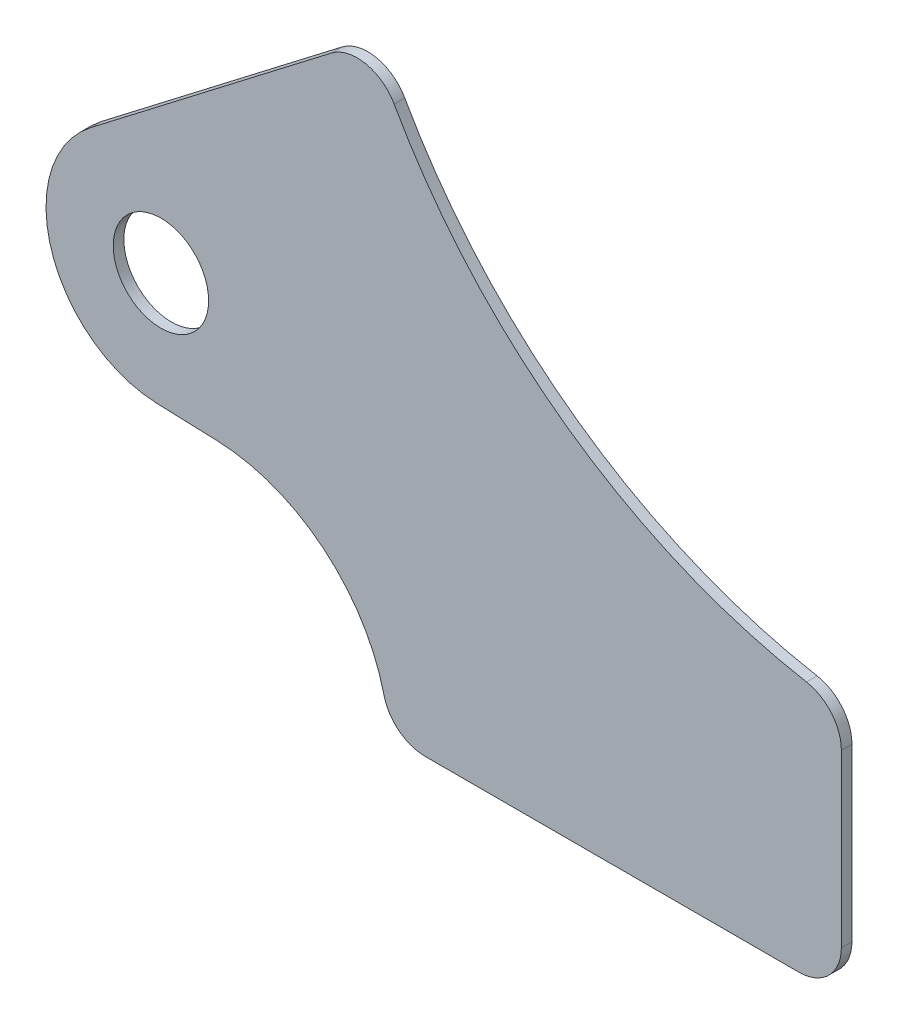
ISO-10303-21;
HEADER;
FILE_DESCRIPTION(('STEP AP214'),'2;1');
FILE_NAME('part.step','',(''),(''),'','','');
FILE_SCHEMA(('AUTOMOTIVE_DESIGN { 1 0 10303 214 1 1 1 1 }'));
ENDSEC;
DATA;
#1=APPLICATION_CONTEXT('core data for automotive mechanical design processes');
#2=APPLICATION_PROTOCOL_DEFINITION('international standard','automotive_design',2000,#1);
#3=PRODUCT_CONTEXT('',#1,'mechanical');
#4=PRODUCT('Part','Part','',(#3));
#5=PRODUCT_RELATED_PRODUCT_CATEGORY('part','',(#4));
#6=PRODUCT_DEFINITION_FORMATION('','',#4);
#7=PRODUCT_DEFINITION_CONTEXT('part definition',#1,'design');
#8=PRODUCT_DEFINITION('design','',#6,#7);
#9=PRODUCT_DEFINITION_SHAPE('','',#8);
#10=(LENGTH_UNIT() NAMED_UNIT(*) SI_UNIT(.MILLI.,.METRE.));
#11=(NAMED_UNIT(*) PLANE_ANGLE_UNIT() SI_UNIT($,.RADIAN.));
#12=(NAMED_UNIT(*) SI_UNIT($,.STERADIAN.) SOLID_ANGLE_UNIT());
#13=UNCERTAINTY_MEASURE_WITH_UNIT(LENGTH_MEASURE(1.E-05),#10,'distance_accuracy_value','');
#14=(GEOMETRIC_REPRESENTATION_CONTEXT(3) GLOBAL_UNCERTAINTY_ASSIGNED_CONTEXT((#13)) GLOBAL_UNIT_ASSIGNED_CONTEXT((#10,
#11,#12)) REPRESENTATION_CONTEXT('',''));
#15=CARTESIAN_POINT('',(0.,0.,0.));
#16=DIRECTION('',(0.,0.,1.));
#17=DIRECTION('',(1.,0.,0.));
#18=AXIS2_PLACEMENT_3D('',#15,#16,#17);
#19=CARTESIAN_POINT('',(69.0619678457086,-96.3981481371445,0.5));
#20=DIRECTION('',(0.,0.,-1.));
#21=DIRECTION('',(-1.,0.,0.));
#22=AXIS2_PLACEMENT_3D('',#19,#20,#21);
#23=PLANE('',#22);
#24=CARTESIAN_POINT('',(69.0619678457086,-96.3981481371445,0.5));
#25=DIRECTION('',(0.,0.,1.));
#26=DIRECTION('',(-1.,0.,0.));
#27=AXIS2_PLACEMENT_3D('',#24,#25,#26);
#28=CIRCLE('',#27,5.42071896114853);
#29=CARTESIAN_POINT('',(65.7594486030963,-92.0995948098109,0.5));
#30=VERTEX_POINT('',#29);
#31=CARTESIAN_POINT('',(68.866411541053,-101.815338533232,0.5));
#32=VERTEX_POINT('',#31);
#33=EDGE_CURVE('E159',#30,#32,#28,.T.);
#34=ORIENTED_EDGE('',*,*,#33,.T.);
#35=DIRECTION('',(0.99934905958303,-0.0360757135828762,0.));
#36=VECTOR('',#35,1.);
#37=CARTESIAN_POINT('',(68.866411541053,-101.815338533232,0.5));
#38=LINE('',#37,#36);
#39=CARTESIAN_POINT('',(71.7097317347927,-101.917980151744,0.5));
#40=VERTEX_POINT('',#39);
#41=EDGE_CURVE('E130',#32,#40,#38,.T.);
#42=ORIENTED_EDGE('',*,*,#41,.T.);
#43=CARTESIAN_POINT('',(71.4063879557372,-110.321038337497,0.5));
#44=DIRECTION('',(0.,0.,-1.));
#45=DIRECTION('',(1.,0.,0.));
#46=AXIS2_PLACEMENT_3D('',#43,#44,#45);
#47=CIRCLE('',#46,8.4085316388438);
#48=CARTESIAN_POINT('',(79.5867015670892,-108.375306202446,0.5));
#49=VERTEX_POINT('',#48);
#50=EDGE_CURVE('E162',#40,#49,#47,.T.);
#51=ORIENTED_EDGE('',*,*,#50,.T.);
#52=CARTESIAN_POINT('',(81.532419074665,-107.912506698651,0.5));
#53=DIRECTION('',(0.,0.,1.));
#54=DIRECTION('',(1.,0.,0.));
#55=AXIS2_PLACEMENT_3D('',#52,#53,#54);
#56=CIRCLE('',#55,2.);
#57=CARTESIAN_POINT('',(81.532419074665,-109.912506698651,0.5));
#58=VERTEX_POINT('',#57);
#59=EDGE_CURVE('E164',#49,#58,#56,.T.);
#60=ORIENTED_EDGE('',*,*,#59,.T.);
#61=DIRECTION('',(1.,0.,0.));
#62=VECTOR('',#61,1.);
#63=CARTESIAN_POINT('',(99.1688425464614,-109.912506698651,0.5));
#64=LINE('',#63,#62);
#65=CARTESIAN_POINT('',(99.1688425464614,-109.912506698651,0.5));
#66=VERTEX_POINT('',#65);
#67=EDGE_CURVE('E166',#58,#66,#64,.T.);
#68=ORIENTED_EDGE('',*,*,#67,.T.);
#69=CARTESIAN_POINT('',(99.1688425464614,-107.912506698651,0.5));
#70=DIRECTION('',(0.,0.,1.));
#71=DIRECTION('',(1.,0.,0.));
#72=AXIS2_PLACEMENT_3D('',#69,#70,#71);
#73=CIRCLE('',#72,2.);
#74=CARTESIAN_POINT('',(101.168842546461,-107.912506698651,0.5));
#75=VERTEX_POINT('',#74);
#76=EDGE_CURVE('E168',#66,#75,#73,.T.);
#77=ORIENTED_EDGE('',*,*,#76,.T.);
#78=DIRECTION('',(0.,1.,0.));
#79=VECTOR('',#78,1.);
#80=CARTESIAN_POINT('',(101.168842546461,-99.8422971697387,0.5));
#81=LINE('',#80,#79);
#82=CARTESIAN_POINT('',(101.168842546461,-99.8422971697387,0.5));
#83=VERTEX_POINT('',#82);
#84=EDGE_CURVE('E170',#75,#83,#81,.T.);
#85=ORIENTED_EDGE('',*,*,#84,.T.);
#86=CARTESIAN_POINT('',(99.1688425464614,-99.8422971697387,0.5));
#87=DIRECTION('',(0.,0.,1.));
#88=DIRECTION('',(1.,0.,0.));
#89=AXIS2_PLACEMENT_3D('',#86,#87,#88);
#90=CIRCLE('',#89,2.);
#91=CARTESIAN_POINT('',(99.5247156634242,-97.8742132475892,0.5));
#92=VERTEX_POINT('',#91);
#93=EDGE_CURVE('E172',#83,#92,#90,.T.);
#94=ORIENTED_EDGE('',*,*,#93,.T.);
#95=CARTESIAN_POINT('',(104.506939300903,-70.3210383374967,0.5));
#96=DIRECTION('',(0.,0.,-1.));
#97=DIRECTION('',(1.,0.,0.));
#98=AXIS2_PLACEMENT_3D('',#95,#96,#97);
#99=CIRCLE('',#98,28.);
#100=CARTESIAN_POINT('',(80.070719907068,-83.9911217950465,0.5));
#101=VERTEX_POINT('',#100);
#102=EDGE_CURVE('E174',#92,#101,#99,.T.);
#103=ORIENTED_EDGE('',*,*,#102,.T.);
#104=CARTESIAN_POINT('',(78.3252756646512,-84.9675563277287,0.5));
#105=DIRECTION('',(0.,0.,1.));
#106=DIRECTION('',(1.,0.,0.));
#107=AXIS2_PLACEMENT_3D('',#104,#105,#106);
#108=CIRCLE('',#107,1.99999999999999);
#109=CARTESIAN_POINT('',(77.1067955086859,-83.3815846667212,0.5));
#110=VERTEX_POINT('',#109);
#111=EDGE_CURVE('E53',#101,#110,#108,.T.);
#112=ORIENTED_EDGE('',*,*,#111,.T.);
#113=DIRECTION('',(-0.792985830503717,-0.609240077982671,0.));
#114=VECTOR('',#113,1.);
#115=CARTESIAN_POINT('',(65.7594486030963,-92.0995948098109,0.5));
#116=LINE('',#115,#114);
#117=EDGE_CURVE('E48',#110,#30,#116,.T.);
#118=ORIENTED_EDGE('',*,*,#117,.T.);
#119=EDGE_LOOP('',(#34,#42,#51,#60,#68,#77,#85,#94,#103,#112,#118));
#120=FACE_BOUND('',#119,.T.);
#121=CARTESIAN_POINT('',(69.0619678457086,-96.3981481371445,0.5));
#122=DIRECTION('',(0.,0.,1.));
#123=DIRECTION('',(1.,0.,0.));
#124=AXIS2_PLACEMENT_3D('',#121,#122,#123);
#125=CIRCLE('',#124,2.25);
#126=CARTESIAN_POINT('',(71.3119678457086,-96.3981481371445,0.5));
#127=VERTEX_POINT('',#126);
#128=EDGE_CURVE('E135',#127,#127,#125,.T.);
#129=ORIENTED_EDGE('',*,*,#128,.F.);
#130=EDGE_LOOP('',(#129));
#131=FACE_BOUND('',#130,.T.);
#132=ADVANCED_FACE('F33',(#120,#131),#23,.F.);
#133=CARTESIAN_POINT('',(69.0619678457086,-96.3981481371445,0.));
#134=DIRECTION('',(0.,0.,-1.));
#135=DIRECTION('',(-1.,0.,0.));
#136=AXIS2_PLACEMENT_3D('',#133,#134,#135);
#137=PLANE('',#136);
#138=CARTESIAN_POINT('',(69.0619678457086,-96.3981481371445,0.));
#139=DIRECTION('',(0.,0.,1.));
#140=DIRECTION('',(-1.,0.,0.));
#141=AXIS2_PLACEMENT_3D('',#138,#139,#140);
#142=CIRCLE('',#141,5.42071896114853);
#143=CARTESIAN_POINT('',(65.7594486030963,-92.0995948098109,0.));
#144=VERTEX_POINT('',#143);
#145=CARTESIAN_POINT('',(68.866411541053,-101.815338533232,0.));
#146=VERTEX_POINT('',#145);
#147=EDGE_CURVE('E121',#144,#146,#142,.T.);
#148=ORIENTED_EDGE('',*,*,#147,.F.);
#149=DIRECTION('',(-0.792985830503717,-0.609240077982671,0.));
#150=VECTOR('',#149,1.);
#151=CARTESIAN_POINT('',(65.7594486030963,-92.0995948098109,0.));
#152=LINE('',#151,#150);
#153=CARTESIAN_POINT('',(77.1067955086859,-83.3815846667212,0.));
#154=VERTEX_POINT('',#153);
#155=EDGE_CURVE('E157',#154,#144,#152,.T.);
#156=ORIENTED_EDGE('',*,*,#155,.F.);
#157=CARTESIAN_POINT('',(78.3252756646512,-84.9675563277287,0.));
#158=DIRECTION('',(0.,0.,1.));
#159=DIRECTION('',(1.,0.,0.));
#160=AXIS2_PLACEMENT_3D('',#157,#158,#159);
#161=CIRCLE('',#160,1.99999999999999);
#162=CARTESIAN_POINT('',(80.070719907068,-83.9911217950465,0.));
#163=VERTEX_POINT('',#162);
#164=EDGE_CURVE('E155',#163,#154,#161,.T.);
#165=ORIENTED_EDGE('',*,*,#164,.F.);
#166=CARTESIAN_POINT('',(104.506939300903,-70.3210383374967,0.));
#167=DIRECTION('',(0.,0.,-1.));
#168=DIRECTION('',(1.,0.,0.));
#169=AXIS2_PLACEMENT_3D('',#166,#167,#168);
#170=CIRCLE('',#169,28.);
#171=CARTESIAN_POINT('',(99.5247156634242,-97.8742132475892,0.));
#172=VERTEX_POINT('',#171);
#173=EDGE_CURVE('E153',#172,#163,#170,.T.);
#174=ORIENTED_EDGE('',*,*,#173,.F.);
#175=CARTESIAN_POINT('',(99.1688425464614,-99.8422971697387,0.));
#176=DIRECTION('',(0.,0.,1.));
#177=DIRECTION('',(1.,0.,0.));
#178=AXIS2_PLACEMENT_3D('',#175,#176,#177);
#179=CIRCLE('',#178,2.);
#180=CARTESIAN_POINT('',(101.168842546461,-99.8422971697387,0.));
#181=VERTEX_POINT('',#180);
#182=EDGE_CURVE('E151',#181,#172,#179,.T.);
#183=ORIENTED_EDGE('',*,*,#182,.F.);
#184=DIRECTION('',(0.,1.,0.));
#185=VECTOR('',#184,1.);
#186=CARTESIAN_POINT('',(101.168842546461,-99.8422971697387,0.));
#187=LINE('',#186,#185);
#188=CARTESIAN_POINT('',(101.168842546461,-107.912506698651,0.));
#189=VERTEX_POINT('',#188);
#190=EDGE_CURVE('E149',#189,#181,#187,.T.);
#191=ORIENTED_EDGE('',*,*,#190,.F.);
#192=CARTESIAN_POINT('',(99.1688425464614,-107.912506698651,0.));
#193=DIRECTION('',(0.,0.,1.));
#194=DIRECTION('',(1.,0.,0.));
#195=AXIS2_PLACEMENT_3D('',#192,#193,#194);
#196=CIRCLE('',#195,2.);
#197=CARTESIAN_POINT('',(99.1688425464614,-109.912506698651,0.));
#198=VERTEX_POINT('',#197);
#199=EDGE_CURVE('E147',#198,#189,#196,.T.);
#200=ORIENTED_EDGE('',*,*,#199,.F.);
#201=DIRECTION('',(1.,0.,0.));
#202=VECTOR('',#201,1.);
#203=CARTESIAN_POINT('',(99.1688425464614,-109.912506698651,0.));
#204=LINE('',#203,#202);
#205=CARTESIAN_POINT('',(81.532419074665,-109.912506698651,0.));
#206=VERTEX_POINT('',#205);
#207=EDGE_CURVE('E145',#206,#198,#204,.T.);
#208=ORIENTED_EDGE('',*,*,#207,.F.);
#209=CARTESIAN_POINT('',(81.532419074665,-107.912506698651,0.));
#210=DIRECTION('',(0.,0.,1.));
#211=DIRECTION('',(1.,0.,0.));
#212=AXIS2_PLACEMENT_3D('',#209,#210,#211);
#213=CIRCLE('',#212,2.);
#214=CARTESIAN_POINT('',(79.5867015670892,-108.375306202446,0.));
#215=VERTEX_POINT('',#214);
#216=EDGE_CURVE('E143',#215,#206,#213,.T.);
#217=ORIENTED_EDGE('',*,*,#216,.F.);
#218=CARTESIAN_POINT('',(71.4063879557372,-110.321038337497,0.));
#219=DIRECTION('',(0.,0.,-1.));
#220=DIRECTION('',(1.,0.,0.));
#221=AXIS2_PLACEMENT_3D('',#218,#219,#220);
#222=CIRCLE('',#221,8.4085316388438);
#223=CARTESIAN_POINT('',(71.7097317347927,-101.917980151744,0.));
#224=VERTEX_POINT('',#223);
#225=EDGE_CURVE('E123',#224,#215,#222,.T.);
#226=ORIENTED_EDGE('',*,*,#225,.F.);
#227=DIRECTION('',(0.99934905958303,-0.0360757135828762,0.));
#228=VECTOR('',#227,1.);
#229=CARTESIAN_POINT('',(68.866411541053,-101.815338533232,0.));
#230=LINE('',#229,#228);
#231=EDGE_CURVE('E116',#146,#224,#230,.T.);
#232=ORIENTED_EDGE('',*,*,#231,.F.);
#233=EDGE_LOOP('',(#148,#156,#165,#174,#183,#191,#200,#208,#217,#226,#232));
#234=FACE_BOUND('',#233,.T.);
#235=CARTESIAN_POINT('',(69.0619678457086,-96.3981481371445,0.));
#236=DIRECTION('',(0.,0.,1.));
#237=DIRECTION('',(1.,0.,0.));
#238=AXIS2_PLACEMENT_3D('',#235,#236,#237);
#239=CIRCLE('',#238,2.25);
#240=CARTESIAN_POINT('',(71.3119678457086,-96.3981481371445,0.));
#241=VERTEX_POINT('',#240);
#242=EDGE_CURVE('E138',#241,#241,#239,.T.);
#243=ORIENTED_EDGE('',*,*,#242,.T.);
#244=EDGE_LOOP('',(#243));
#245=FACE_BOUND('',#244,.T.);
#246=ADVANCED_FACE('F117',(#234,#245),#137,.T.);
#247=CARTESIAN_POINT('',(69.0619678457086,-96.3981481371445,0.5));
#248=DIRECTION('',(0.,0.,-1.));
#249=DIRECTION('',(-1.,0.,0.));
#250=AXIS2_PLACEMENT_3D('',#247,#248,#249);
#251=CYLINDRICAL_SURFACE('',#250,5.42071896114853);
#252=ORIENTED_EDGE('',*,*,#147,.T.);
#253=DIRECTION('',(0.,0.,-1.));
#254=VECTOR('',#253,1.);
#255=CARTESIAN_POINT('',(68.866411541053,-101.815338533232,0.5));
#256=LINE('',#255,#254);
#257=EDGE_CURVE('E11',#32,#146,#256,.T.);
#258=ORIENTED_EDGE('',*,*,#257,.F.);
#259=ORIENTED_EDGE('',*,*,#33,.F.);
#260=DIRECTION('',(0.,0.,-1.));
#261=VECTOR('',#260,1.);
#262=CARTESIAN_POINT('',(65.7594486030963,-92.0995948098109,0.5));
#263=LINE('',#262,#261);
#264=EDGE_CURVE('E134',#30,#144,#263,.T.);
#265=ORIENTED_EDGE('',*,*,#264,.T.);
#266=EDGE_LOOP('',(#252,#258,#259,#265));
#267=FACE_BOUND('',#266,.T.);
#268=ADVANCED_FACE('F35',(#267),#251,.T.);
#269=CARTESIAN_POINT('',(68.866411541053,-101.815338533232,0.5));
#270=DIRECTION('',(0.0360757135828762,0.99934905958303,0.));
#271=DIRECTION('',(-0.99934905958303,0.0360757135828762,0.));
#272=AXIS2_PLACEMENT_3D('',#269,#270,#271);
#273=PLANE('',#272);
#274=ORIENTED_EDGE('',*,*,#231,.T.);
#275=DIRECTION('',(0.,0.,-1.));
#276=VECTOR('',#275,1.);
#277=CARTESIAN_POINT('',(71.7097317347927,-101.917980151744,0.5));
#278=LINE('',#277,#276);
#279=EDGE_CURVE('E41',#40,#224,#278,.T.);
#280=ORIENTED_EDGE('',*,*,#279,.F.);
#281=ORIENTED_EDGE('',*,*,#41,.F.);
#282=ORIENTED_EDGE('',*,*,#257,.T.);
#283=EDGE_LOOP('',(#274,#280,#281,#282));
#284=FACE_BOUND('',#283,.T.);
#285=ADVANCED_FACE('F129',(#284),#273,.F.);
#286=CARTESIAN_POINT('',(71.4063879557372,-110.321038337497,0.5));
#287=DIRECTION('',(0.,0.,-1.));
#288=DIRECTION('',(-1.,0.,0.));
#289=AXIS2_PLACEMENT_3D('',#286,#287,#288);
#290=CYLINDRICAL_SURFACE('',#289,8.4085316388438);
#291=ORIENTED_EDGE('',*,*,#225,.T.);
#292=DIRECTION('',(0.,0.,-1.));
#293=VECTOR('',#292,1.);
#294=CARTESIAN_POINT('',(79.5867015670892,-108.375306202446,0.5));
#295=LINE('',#294,#293);
#296=EDGE_CURVE('E200',#49,#215,#295,.T.);
#297=ORIENTED_EDGE('',*,*,#296,.F.);
#298=ORIENTED_EDGE('',*,*,#50,.F.);
#299=ORIENTED_EDGE('',*,*,#279,.T.);
#300=EDGE_LOOP('',(#291,#297,#298,#299));
#301=FACE_BOUND('',#300,.T.);
#302=ADVANCED_FACE('F204',(#301),#290,.F.);
#303=CARTESIAN_POINT('',(81.532419074665,-107.912506698651,0.5));
#304=DIRECTION('',(0.,0.,-1.));
#305=DIRECTION('',(-1.,0.,0.));
#306=AXIS2_PLACEMENT_3D('',#303,#304,#305);
#307=CYLINDRICAL_SURFACE('',#306,2.);
#308=ORIENTED_EDGE('',*,*,#216,.T.);
#309=DIRECTION('',(0.,0.,-1.));
#310=VECTOR('',#309,1.);
#311=CARTESIAN_POINT('',(81.532419074665,-109.912506698651,0.5));
#312=LINE('',#311,#310);
#313=EDGE_CURVE('E197',#58,#206,#312,.T.);
#314=ORIENTED_EDGE('',*,*,#313,.F.);
#315=ORIENTED_EDGE('',*,*,#59,.F.);
#316=ORIENTED_EDGE('',*,*,#296,.T.);
#317=EDGE_LOOP('',(#308,#314,#315,#316));
#318=FACE_BOUND('',#317,.T.);
#319=ADVANCED_FACE('F212',(#318),#307,.T.);
#320=CARTESIAN_POINT('',(99.1688425464614,-109.912506698651,0.5));
#321=DIRECTION('',(0.,1.,0.));
#322=DIRECTION('',(-1.,0.,0.));
#323=AXIS2_PLACEMENT_3D('',#320,#321,#322);
#324=PLANE('',#323);
#325=ORIENTED_EDGE('',*,*,#207,.T.);
#326=DIRECTION('',(0.,0.,-1.));
#327=VECTOR('',#326,1.);
#328=CARTESIAN_POINT('',(99.1688425464614,-109.912506698651,0.5));
#329=LINE('',#328,#327);
#330=EDGE_CURVE('E194',#66,#198,#329,.T.);
#331=ORIENTED_EDGE('',*,*,#330,.F.);
#332=ORIENTED_EDGE('',*,*,#67,.F.);
#333=ORIENTED_EDGE('',*,*,#313,.T.);
#334=EDGE_LOOP('',(#325,#331,#332,#333));
#335=FACE_BOUND('',#334,.T.);
#336=ADVANCED_FACE('F215',(#335),#324,.F.);
#337=CARTESIAN_POINT('',(99.1688425464614,-107.912506698651,0.5));
#338=DIRECTION('',(0.,0.,-1.));
#339=DIRECTION('',(-1.,0.,0.));
#340=AXIS2_PLACEMENT_3D('',#337,#338,#339);
#341=CYLINDRICAL_SURFACE('',#340,2.);
#342=ORIENTED_EDGE('',*,*,#199,.T.);
#343=DIRECTION('',(0.,0.,-1.));
#344=VECTOR('',#343,1.);
#345=CARTESIAN_POINT('',(101.168842546461,-107.912506698651,0.5));
#346=LINE('',#345,#344);
#347=EDGE_CURVE('E191',#75,#189,#346,.T.);
#348=ORIENTED_EDGE('',*,*,#347,.F.);
#349=ORIENTED_EDGE('',*,*,#76,.F.);
#350=ORIENTED_EDGE('',*,*,#330,.T.);
#351=EDGE_LOOP('',(#342,#348,#349,#350));
#352=FACE_BOUND('',#351,.T.);
#353=ADVANCED_FACE('F220',(#352),#341,.T.);
#354=CARTESIAN_POINT('',(101.168842546461,-99.8422971697387,0.5));
#355=DIRECTION('',(-1.,0.,0.));
#356=DIRECTION('',(0.,0.,1.));
#357=AXIS2_PLACEMENT_3D('',#354,#355,#356);
#358=PLANE('',#357);
#359=ORIENTED_EDGE('',*,*,#190,.T.);
#360=DIRECTION('',(0.,0.,-1.));
#361=VECTOR('',#360,1.);
#362=CARTESIAN_POINT('',(101.168842546461,-99.8422971697387,0.5));
#363=LINE('',#362,#361);
#364=EDGE_CURVE('E188',#83,#181,#363,.T.);
#365=ORIENTED_EDGE('',*,*,#364,.F.);
#366=ORIENTED_EDGE('',*,*,#84,.F.);
#367=ORIENTED_EDGE('',*,*,#347,.T.);
#368=EDGE_LOOP('',(#359,#365,#366,#367));
#369=FACE_BOUND('',#368,.T.);
#370=ADVANCED_FACE('F226',(#369),#358,.F.);
#371=CARTESIAN_POINT('',(99.1688425464614,-99.8422971697387,0.5));
#372=DIRECTION('',(0.,0.,-1.));
#373=DIRECTION('',(-1.,0.,0.));
#374=AXIS2_PLACEMENT_3D('',#371,#372,#373);
#375=CYLINDRICAL_SURFACE('',#374,2.);
#376=ORIENTED_EDGE('',*,*,#182,.T.);
#377=DIRECTION('',(0.,0.,-1.));
#378=VECTOR('',#377,1.);
#379=CARTESIAN_POINT('',(99.5247156634242,-97.8742132475892,0.5));
#380=LINE('',#379,#378);
#381=EDGE_CURVE('E185',#92,#172,#380,.T.);
#382=ORIENTED_EDGE('',*,*,#381,.F.);
#383=ORIENTED_EDGE('',*,*,#93,.F.);
#384=ORIENTED_EDGE('',*,*,#364,.T.);
#385=EDGE_LOOP('',(#376,#382,#383,#384));
#386=FACE_BOUND('',#385,.T.);
#387=ADVANCED_FACE('F230',(#386),#375,.T.);
#388=CARTESIAN_POINT('',(104.506939300903,-70.3210383374967,0.5));
#389=DIRECTION('',(0.,0.,-1.));
#390=DIRECTION('',(-1.,0.,0.));
#391=AXIS2_PLACEMENT_3D('',#388,#389,#390);
#392=CYLINDRICAL_SURFACE('',#391,28.);
#393=ORIENTED_EDGE('',*,*,#173,.T.);
#394=DIRECTION('',(0.,0.,-1.));
#395=VECTOR('',#394,1.);
#396=CARTESIAN_POINT('',(80.070719907068,-83.9911217950465,0.5));
#397=LINE('',#396,#395);
#398=EDGE_CURVE('E182',#101,#163,#397,.T.);
#399=ORIENTED_EDGE('',*,*,#398,.F.);
#400=ORIENTED_EDGE('',*,*,#102,.F.);
#401=ORIENTED_EDGE('',*,*,#381,.T.);
#402=EDGE_LOOP('',(#393,#399,#400,#401));
#403=FACE_BOUND('',#402,.T.);
#404=ADVANCED_FACE('F235',(#403),#392,.F.);
#405=CARTESIAN_POINT('',(78.3252756646512,-84.9675563277287,0.5));
#406=DIRECTION('',(0.,0.,-1.));
#407=DIRECTION('',(-1.,0.,0.));
#408=AXIS2_PLACEMENT_3D('',#405,#406,#407);
#409=CYLINDRICAL_SURFACE('',#408,1.99999999999999);
#410=ORIENTED_EDGE('',*,*,#164,.T.);
#411=DIRECTION('',(0.,0.,-1.));
#412=VECTOR('',#411,1.);
#413=CARTESIAN_POINT('',(77.1067955086859,-83.3815846667212,0.5));
#414=LINE('',#413,#412);
#415=EDGE_CURVE('E179',#110,#154,#414,.T.);
#416=ORIENTED_EDGE('',*,*,#415,.F.);
#417=ORIENTED_EDGE('',*,*,#111,.F.);
#418=ORIENTED_EDGE('',*,*,#398,.T.);
#419=EDGE_LOOP('',(#410,#416,#417,#418));
#420=FACE_BOUND('',#419,.T.);
#421=ADVANCED_FACE('F238',(#420),#409,.T.);
#422=CARTESIAN_POINT('',(65.7594486030963,-92.0995948098109,0.5));
#423=DIRECTION('',(0.609240077982671,-0.792985830503717,0.));
#424=DIRECTION('',(0.792985830503717,0.609240077982671,0.));
#425=AXIS2_PLACEMENT_3D('',#422,#423,#424);
#426=PLANE('',#425);
#427=ORIENTED_EDGE('',*,*,#155,.T.);
#428=ORIENTED_EDGE('',*,*,#264,.F.);
#429=ORIENTED_EDGE('',*,*,#117,.F.);
#430=ORIENTED_EDGE('',*,*,#415,.T.);
#431=EDGE_LOOP('',(#427,#428,#429,#430));
#432=FACE_BOUND('',#431,.T.);
#433=ADVANCED_FACE('F240',(#432),#426,.F.);
#434=CARTESIAN_POINT('',(69.0619678457086,-96.3981481371445,0.5));
#435=DIRECTION('',(0.,0.,-1.));
#436=DIRECTION('',(-1.,0.,0.));
#437=AXIS2_PLACEMENT_3D('',#434,#435,#436);
#438=CYLINDRICAL_SURFACE('',#437,2.25);
#439=ORIENTED_EDGE('',*,*,#128,.T.);
#440=EDGE_LOOP('',(#439));
#441=FACE_BOUND('',#440,.T.);
#442=ORIENTED_EDGE('',*,*,#242,.F.);
#443=EDGE_LOOP('',(#442));
#444=FACE_BOUND('',#443,.T.);
#445=ADVANCED_FACE('F242',(#441,#444),#438,.F.);
#446=CLOSED_SHELL('',(#132,#246,#268,#285,#302,#319,#336,#353,#370,#387,#404,#421,#433,#445));
#447=MANIFOLD_SOLID_BREP('B2',#446);
#448=ADVANCED_BREP_SHAPE_REPRESENTATION('',(#18,#447),#14);
#449=SHAPE_DEFINITION_REPRESENTATION(#9,#448);
ENDSEC;
END-ISO-10303-21;
